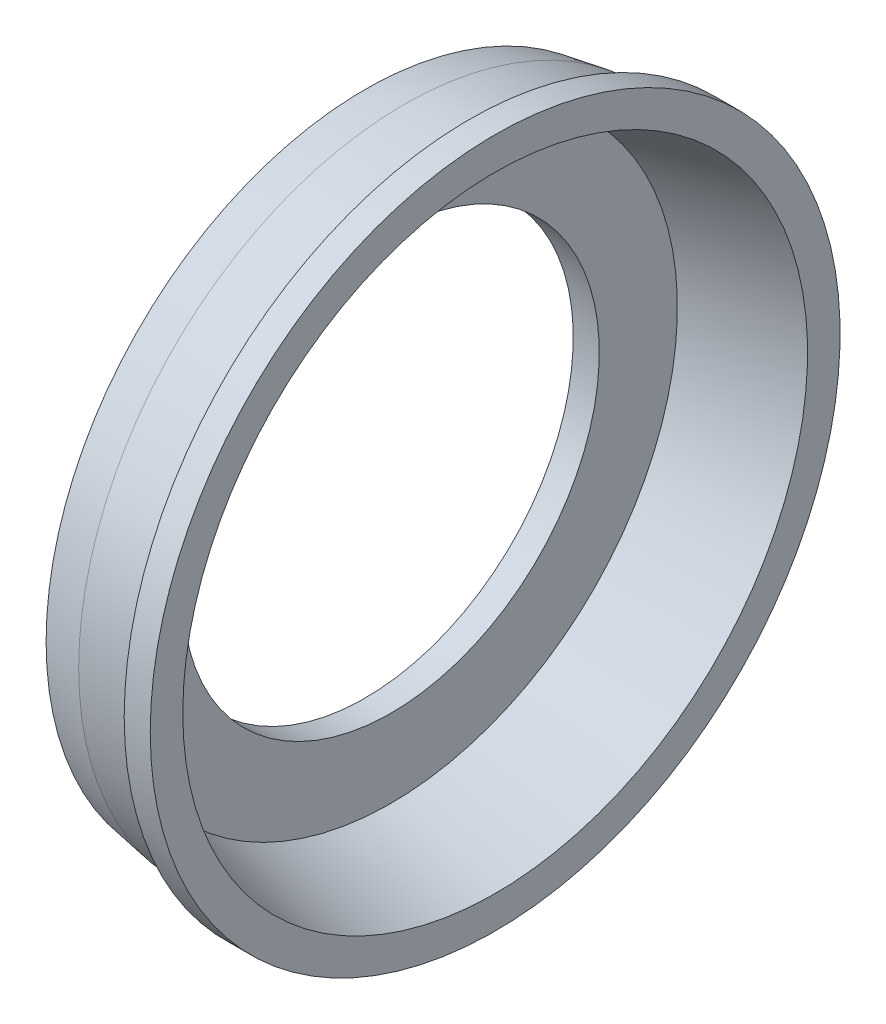
ISO-10303-21;
HEADER;
FILE_DESCRIPTION(('STEP AP214'),'2;1');
FILE_NAME('part.step','',(''),(''),'','','');
FILE_SCHEMA(('AUTOMOTIVE_DESIGN { 1 0 10303 214 1 1 1 1 }'));
ENDSEC;
DATA;
#1=APPLICATION_CONTEXT('core data for automotive mechanical design processes');
#2=APPLICATION_PROTOCOL_DEFINITION('international standard','automotive_design',2000,#1);
#3=PRODUCT_CONTEXT('',#1,'mechanical');
#4=PRODUCT('Part','Part','',(#3));
#5=PRODUCT_RELATED_PRODUCT_CATEGORY('part','',(#4));
#6=PRODUCT_DEFINITION_FORMATION('','',#4);
#7=PRODUCT_DEFINITION_CONTEXT('part definition',#1,'design');
#8=PRODUCT_DEFINITION('design','',#6,#7);
#9=PRODUCT_DEFINITION_SHAPE('','',#8);
#10=(LENGTH_UNIT() NAMED_UNIT(*) SI_UNIT(.MILLI.,.METRE.));
#11=(NAMED_UNIT(*) PLANE_ANGLE_UNIT() SI_UNIT($,.RADIAN.));
#12=(NAMED_UNIT(*) SI_UNIT($,.STERADIAN.) SOLID_ANGLE_UNIT());
#13=UNCERTAINTY_MEASURE_WITH_UNIT(LENGTH_MEASURE(1.E-05),#10,'distance_accuracy_value','');
#14=(GEOMETRIC_REPRESENTATION_CONTEXT(3) GLOBAL_UNCERTAINTY_ASSIGNED_CONTEXT((#13)) GLOBAL_UNIT_ASSIGNED_CONTEXT((#10,
#11,#12)) REPRESENTATION_CONTEXT('',''));
#15=CARTESIAN_POINT('',(0.,0.,0.));
#16=DIRECTION('',(0.,0.,1.));
#17=DIRECTION('',(1.,0.,0.));
#18=AXIS2_PLACEMENT_3D('',#15,#16,#17);
#19=CARTESIAN_POINT('',(0.,25.,0.));
#20=DIRECTION('',(1.,0.,0.));
#21=DIRECTION('',(0.,0.,-1.));
#22=AXIS2_PLACEMENT_3D('',#19,#20,#21);
#23=PLANE('',#22);
#24=CARTESIAN_POINT('',(0.,0.,0.));
#25=DIRECTION('',(-1.,0.,0.));
#26=DIRECTION('',(0.,0.,1.));
#27=AXIS2_PLACEMENT_3D('',#24,#25,#26);
#28=CIRCLE('',#27,25.);
#29=CARTESIAN_POINT('',(0.,0.,25.));
#30=VERTEX_POINT('',#29);
#31=EDGE_CURVE('E70',#30,#30,#28,.T.);
#32=ORIENTED_EDGE('',*,*,#31,.F.);
#33=EDGE_LOOP('',(#32));
#34=FACE_BOUND('',#33,.T.);
#35=CARTESIAN_POINT('',(0.,0.,0.));
#36=DIRECTION('',(-1.,0.,0.));
#37=DIRECTION('',(0.,0.,1.));
#38=AXIS2_PLACEMENT_3D('',#35,#36,#37);
#39=CIRCLE('',#38,26.5);
#40=CARTESIAN_POINT('',(0.,0.,26.5));
#41=VERTEX_POINT('',#40);
#42=EDGE_CURVE('E49',#41,#41,#39,.T.);
#43=ORIENTED_EDGE('',*,*,#42,.T.);
#44=EDGE_LOOP('',(#43));
#45=FACE_BOUND('',#44,.T.);
#46=ADVANCED_FACE('F37',(#34,#45),#23,.F.);
#47=CARTESIAN_POINT('',(-21.448486921545,0.,0.));
#48=DIRECTION('',(-1.,0.,0.));
#49=DIRECTION('',(0.,0.,1.));
#50=AXIS2_PLACEMENT_3D('',#47,#48,#49);
#51=CYLINDRICAL_SURFACE('',#50,26.5);
#52=ORIENTED_EDGE('',*,*,#42,.F.);
#53=EDGE_LOOP('',(#52));
#54=FACE_BOUND('',#53,.T.);
#55=CARTESIAN_POINT('',(2.,0.,0.));
#56=DIRECTION('',(-1.,0.,0.));
#57=DIRECTION('',(0.,0.,1.));
#58=AXIS2_PLACEMENT_3D('',#55,#56,#57);
#59=CIRCLE('',#58,26.5);
#60=CARTESIAN_POINT('',(2.,0.,26.5));
#61=VERTEX_POINT('',#60);
#62=EDGE_CURVE('E53',#61,#61,#59,.T.);
#63=ORIENTED_EDGE('',*,*,#62,.T.);
#64=EDGE_LOOP('',(#63));
#65=FACE_BOUND('',#64,.T.);
#66=ADVANCED_FACE('F78',(#54,#65),#51,.T.);
#67=CARTESIAN_POINT('',(2.,26.5,0.));
#68=DIRECTION('',(-1.,0.,0.));
#69=DIRECTION('',(0.,0.,1.));
#70=AXIS2_PLACEMENT_3D('',#67,#68,#69);
#71=PLANE('',#70);
#72=ORIENTED_EDGE('',*,*,#62,.F.);
#73=EDGE_LOOP('',(#72));
#74=FACE_BOUND('',#73,.T.);
#75=CARTESIAN_POINT('',(2.,0.,0.));
#76=DIRECTION('',(-1.,0.,0.));
#77=DIRECTION('',(0.,0.,1.));
#78=AXIS2_PLACEMENT_3D('',#75,#76,#77);
#79=CIRCLE('',#78,24.);
#80=CARTESIAN_POINT('',(2.,0.,24.));
#81=VERTEX_POINT('',#80);
#82=EDGE_CURVE('E58',#81,#81,#79,.T.);
#83=ORIENTED_EDGE('',*,*,#82,.T.);
#84=EDGE_LOOP('',(#83));
#85=FACE_BOUND('',#84,.T.);
#86=ADVANCED_FACE('F83',(#74,#85),#71,.F.);
#87=CARTESIAN_POINT('',(-6.,0.,0.));
#88=DIRECTION('',(1.,0.,0.));
#89=DIRECTION('',(0.,0.,-1.));
#90=AXIS2_PLACEMENT_3D('',#87,#88,#89);
#91=CONICAL_SURFACE('',#90,22.,0.244978663126863);
#92=ORIENTED_EDGE('',*,*,#82,.F.);
#93=EDGE_LOOP('',(#92));
#94=FACE_BOUND('',#93,.T.);
#95=CARTESIAN_POINT('',(-6.,0.,0.));
#96=DIRECTION('',(-1.,0.,0.));
#97=DIRECTION('',(0.,0.,1.));
#98=AXIS2_PLACEMENT_3D('',#95,#96,#97);
#99=CIRCLE('',#98,22.);
#100=CARTESIAN_POINT('',(-6.,0.,22.));
#101=VERTEX_POINT('',#100);
#102=EDGE_CURVE('E61',#101,#101,#99,.T.);
#103=ORIENTED_EDGE('',*,*,#102,.T.);
#104=EDGE_LOOP('',(#103));
#105=FACE_BOUND('',#104,.T.);
#106=ADVANCED_FACE('F89',(#94,#105),#91,.F.);
#107=CARTESIAN_POINT('',(-6.,22.,0.));
#108=DIRECTION('',(-1.,0.,0.));
#109=DIRECTION('',(0.,0.,1.));
#110=AXIS2_PLACEMENT_3D('',#107,#108,#109);
#111=PLANE('',#110);
#112=ORIENTED_EDGE('',*,*,#102,.F.);
#113=EDGE_LOOP('',(#112));
#114=FACE_BOUND('',#113,.T.);
#115=CARTESIAN_POINT('',(-6.,0.,0.));
#116=DIRECTION('',(-1.,0.,0.));
#117=DIRECTION('',(0.,0.,1.));
#118=AXIS2_PLACEMENT_3D('',#115,#116,#117);
#119=CIRCLE('',#118,16.);
#120=CARTESIAN_POINT('',(-6.,0.,16.));
#121=VERTEX_POINT('',#120);
#122=EDGE_CURVE('E64',#121,#121,#119,.T.);
#123=ORIENTED_EDGE('',*,*,#122,.T.);
#124=EDGE_LOOP('',(#123));
#125=FACE_BOUND('',#124,.T.);
#126=ADVANCED_FACE('F95',(#114,#125),#111,.F.);
#127=CARTESIAN_POINT('',(-21.448486921545,0.,0.));
#128=DIRECTION('',(-1.,0.,0.));
#129=DIRECTION('',(0.,0.,1.));
#130=AXIS2_PLACEMENT_3D('',#127,#128,#129);
#131=CYLINDRICAL_SURFACE('',#130,16.);
#132=ORIENTED_EDGE('',*,*,#122,.F.);
#133=EDGE_LOOP('',(#132));
#134=FACE_BOUND('',#133,.T.);
#135=CARTESIAN_POINT('',(-8.,0.,0.));
#136=DIRECTION('',(-1.,0.,0.));
#137=DIRECTION('',(0.,0.,1.));
#138=AXIS2_PLACEMENT_3D('',#135,#136,#137);
#139=CIRCLE('',#138,16.);
#140=CARTESIAN_POINT('',(-8.,0.,16.));
#141=VERTEX_POINT('',#140);
#142=EDGE_CURVE('E67',#141,#141,#139,.T.);
#143=ORIENTED_EDGE('',*,*,#142,.T.);
#144=EDGE_LOOP('',(#143));
#145=FACE_BOUND('',#144,.T.);
#146=ADVANCED_FACE('F101',(#134,#145),#131,.F.);
#147=CARTESIAN_POINT('',(-8.,16.,0.));
#148=DIRECTION('',(1.,0.,0.));
#149=DIRECTION('',(0.,0.,-1.));
#150=AXIS2_PLACEMENT_3D('',#147,#148,#149);
#151=PLANE('',#150);
#152=CARTESIAN_POINT('',(-8.,0.,0.));
#153=DIRECTION('',(1.,0.,0.));
#154=DIRECTION('',(0.,0.,-1.));
#155=AXIS2_PLACEMENT_3D('',#152,#153,#154);
#156=CIRCLE('',#155,24.5);
#157=CARTESIAN_POINT('',(-8.,0.,-24.5));
#158=VERTEX_POINT('',#157);
#159=EDGE_CURVE('E45',#158,#158,#156,.F.);
#160=ORIENTED_EDGE('',*,*,#159,.T.);
#161=EDGE_LOOP('',(#160));
#162=FACE_BOUND('',#161,.T.);
#163=ORIENTED_EDGE('',*,*,#142,.F.);
#164=EDGE_LOOP('',(#163));
#165=FACE_BOUND('',#164,.T.);
#166=ADVANCED_FACE('F107',(#162,#165),#151,.F.);
#167=CARTESIAN_POINT('',(-21.448486921545,0.,0.));
#168=DIRECTION('',(-1.,0.,0.));
#169=DIRECTION('',(0.,0.,1.));
#170=AXIS2_PLACEMENT_3D('',#167,#168,#169);
#171=CYLINDRICAL_SURFACE('',#170,25.);
#172=CARTESIAN_POINT('',(-4.99999999999991,0.,0.));
#173=DIRECTION('',(1.,0.,0.));
#174=DIRECTION('',(0.,0.,-1.));
#175=AXIS2_PLACEMENT_3D('',#172,#173,#174);
#176=CIRCLE('',#175,25.);
#177=CARTESIAN_POINT('',(-4.99999999999991,0.,-25.));
#178=VERTEX_POINT('',#177);
#179=EDGE_CURVE('E10',#178,#178,#176,.T.);
#180=ORIENTED_EDGE('',*,*,#179,.T.);
#181=EDGE_LOOP('',(#180));
#182=FACE_BOUND('',#181,.T.);
#183=ORIENTED_EDGE('',*,*,#31,.T.);
#184=EDGE_LOOP('',(#183));
#185=FACE_BOUND('',#184,.T.);
#186=ADVANCED_FACE('F74',(#182,#185),#171,.T.);
#187=CARTESIAN_POINT('',(-8.,0.,0.));
#188=DIRECTION('',(1.,0.,0.));
#189=DIRECTION('',(0.,0.,-1.));
#190=AXIS2_PLACEMENT_3D('',#187,#188,#189);
#191=CONICAL_SURFACE('',#190,24.5,0.165148677414625);
#192=CARTESIAN_POINT('',(-4.99999999999991,0.,-25.));
#193=CARTESIAN_POINT('',(-5.03124999999991,0.,-24.9947916666667));
#194=CARTESIAN_POINT('',(-5.06249999999992,0.,-24.9895833333333));
#195=CARTESIAN_POINT('',(-5.12499999999992,0.,-24.9791666666667));
#196=CARTESIAN_POINT('',(-5.15624999999992,0.,-24.9739583333333));
#197=CARTESIAN_POINT('',(-5.21874999999992,0.,-24.9635416666667));
#198=CARTESIAN_POINT('',(-5.24999999999992,0.,-24.9583333333333));
#199=CARTESIAN_POINT('',(-5.31249999999992,0.,-24.9479166666667));
#200=CARTESIAN_POINT('',(-5.34374999999992,0.,-24.9427083333333));
#201=CARTESIAN_POINT('',(-5.40624999999993,0.,-24.9322916666667));
#202=CARTESIAN_POINT('',(-5.43749999999993,0.,-24.9270833333333));
#203=CARTESIAN_POINT('',(-5.49999999999993,0.,-24.9166666666667));
#204=CARTESIAN_POINT('',(-5.53124999999993,0.,-24.9114583333333));
#205=CARTESIAN_POINT('',(-5.59374999999993,0.,-24.9010416666667));
#206=CARTESIAN_POINT('',(-5.62499999999993,0.,-24.8958333333333));
#207=CARTESIAN_POINT('',(-5.68749999999994,0.,-24.8854166666667));
#208=CARTESIAN_POINT('',(-5.71874999999994,0.,-24.8802083333333));
#209=CARTESIAN_POINT('',(-5.78124999999994,0.,-24.8697916666667));
#210=CARTESIAN_POINT('',(-5.81249999999994,0.,-24.8645833333333));
#211=CARTESIAN_POINT('',(-5.87499999999994,0.,-24.8541666666667));
#212=CARTESIAN_POINT('',(-5.90624999999994,0.,-24.8489583333333));
#213=CARTESIAN_POINT('',(-5.96874999999994,0.,-24.8385416666667));
#214=CARTESIAN_POINT('',(-5.99999999999994,0.,-24.8333333333333));
#215=CARTESIAN_POINT('',(-6.06249999999995,0.,-24.8229166666667));
#216=CARTESIAN_POINT('',(-6.09374999999995,0.,-24.8177083333333));
#217=CARTESIAN_POINT('',(-6.15624999999995,0.,-24.8072916666667));
#218=CARTESIAN_POINT('',(-6.18749999999995,0.,-24.8020833333333));
#219=CARTESIAN_POINT('',(-6.24999999999995,0.,-24.7916666666667));
#220=CARTESIAN_POINT('',(-6.28124999999995,0.,-24.7864583333333));
#221=CARTESIAN_POINT('',(-6.34374999999995,0.,-24.7760416666667));
#222=CARTESIAN_POINT('',(-6.37499999999995,0.,-24.7708333333333));
#223=CARTESIAN_POINT('',(-6.43749999999996,0.,-24.7604166666667));
#224=CARTESIAN_POINT('',(-6.46874999999996,0.,-24.7552083333333));
#225=CARTESIAN_POINT('',(-6.53124999999996,0.,-24.7447916666667));
#226=CARTESIAN_POINT('',(-6.56249999999996,0.,-24.7395833333333));
#227=CARTESIAN_POINT('',(-6.62499999999996,0.,-24.7291666666667));
#228=CARTESIAN_POINT('',(-6.65624999999996,0.,-24.7239583333333));
#229=CARTESIAN_POINT('',(-6.71874999999996,0.,-24.7135416666667));
#230=CARTESIAN_POINT('',(-6.74999999999997,0.,-24.7083333333333));
#231=CARTESIAN_POINT('',(-6.81249999999997,0.,-24.6979166666667));
#232=CARTESIAN_POINT('',(-6.84374999999997,0.,-24.6927083333333));
#233=CARTESIAN_POINT('',(-6.90624999999997,0.,-24.6822916666667));
#234=CARTESIAN_POINT('',(-6.93749999999997,0.,-24.6770833333333));
#235=CARTESIAN_POINT('',(-6.99999999999997,0.,-24.6666666666667));
#236=CARTESIAN_POINT('',(-7.03124999999997,0.,-24.6614583333333));
#237=CARTESIAN_POINT('',(-7.09374999999998,0.,-24.6510416666667));
#238=CARTESIAN_POINT('',(-7.12499999999998,0.,-24.6458333333333));
#239=CARTESIAN_POINT('',(-7.18749999999998,0.,-24.6354166666667));
#240=CARTESIAN_POINT('',(-7.21874999999998,0.,-24.6302083333333));
#241=CARTESIAN_POINT('',(-7.28124999999998,0.,-24.6197916666667));
#242=CARTESIAN_POINT('',(-7.31249999999998,0.,-24.6145833333333));
#243=CARTESIAN_POINT('',(-7.37499999999998,0.,-24.6041666666667));
#244=CARTESIAN_POINT('',(-7.40624999999998,0.,-24.5989583333333));
#245=CARTESIAN_POINT('',(-7.46874999999999,0.,-24.5885416666667));
#246=CARTESIAN_POINT('',(-7.49999999999999,0.,-24.5833333333333));
#247=CARTESIAN_POINT('',(-7.56249999999999,0.,-24.5729166666667));
#248=CARTESIAN_POINT('',(-7.59374999999999,0.,-24.5677083333333));
#249=CARTESIAN_POINT('',(-7.65624999999999,0.,-24.5572916666667));
#250=CARTESIAN_POINT('',(-7.68749999999999,0.,-24.5520833333333));
#251=CARTESIAN_POINT('',(-7.74999999999999,0.,-24.5416666666667));
#252=CARTESIAN_POINT('',(-7.78124999999999,0.,-24.5364583333333));
#253=CARTESIAN_POINT('',(-7.84375,0.,-24.5260416666667));
#254=CARTESIAN_POINT('',(-7.875,0.,-24.5208333333333));
#255=CARTESIAN_POINT('',(-7.9375,0.,-24.5104166666667));
#256=CARTESIAN_POINT('',(-7.96875,0.,-24.5052083333333));
#257=CARTESIAN_POINT('',(-8.,0.,-24.5));
#258=B_SPLINE_CURVE_WITH_KNOTS('',3,(#192,#193,#194,#195,#196,#197,#198,#199,#200,#201,#202,
#203,#204,#205,#206,#207,#208,#209,#210,#211,#212,#213,#214,#215,#216,#217,#218,#219,#220,#221,
#222,#223,#224,#225,#226,#227,#228,#229,#230,#231,#232,#233,#234,#235,#236,#237,#238,#239,#240,
#241,#242,#243,#244,#245,#246,#247,#248,#249,#250,#251,#252,#253,#254,#255,#256,#257),
.UNSPECIFIED.,.F.,.F.,(4,2,2,2,2,2,2,2,2,2,2,2,2,2,2,2,2,2,2,2,2,2,2,2,2,2,2,2,2,2,2,2,4),(0.,
0.0950431645359135,0.190086329071825,0.285129493607738,0.380172658143649,0.475215822679563,
0.570258987215474,0.665302151751388,0.760345316287299,0.855388480823212,0.950431645359124,
1.04547480989504,1.14051797443095,1.23556113896686,1.33060430350277,1.42564746803869,
1.5206906325746,1.61573379711051,1.71077696164642,1.80582012618234,1.90086329071825,
1.99590645525416,2.09094961979007,2.18599278432599,2.2810359488619,2.37607911339781,
2.47112227793372,2.56616544246963,2.66120860700555,2.75625177154146,2.85129493607737,
2.94633810061328,3.0413812651492),.UNSPECIFIED.);
#259=EDGE_CURVE('BSEAM40',#178,#158,#258,.T.);
#260=ORIENTED_EDGE('',*,*,#179,.F.);
#261=ORIENTED_EDGE('',*,*,#159,.F.);
#262=ORIENTED_EDGE('',*,*,#259,.T.);
#263=ORIENTED_EDGE('',*,*,#259,.F.);
#264=EDGE_LOOP('',(#260,#262,#261,#263));
#265=FACE_BOUND('',#264,.T.);
#266=ADVANCED_FACE('F40',(#265),#191,.T.);
#267=CLOSED_SHELL('',(#46,#66,#86,#106,#126,#146,#166,#186,#266));
#268=MANIFOLD_SOLID_BREP('B2',#267);
#269=ADVANCED_BREP_SHAPE_REPRESENTATION('',(#18,#268),#14);
#270=SHAPE_DEFINITION_REPRESENTATION(#9,#269);
ENDSEC;
END-ISO-10303-21;
